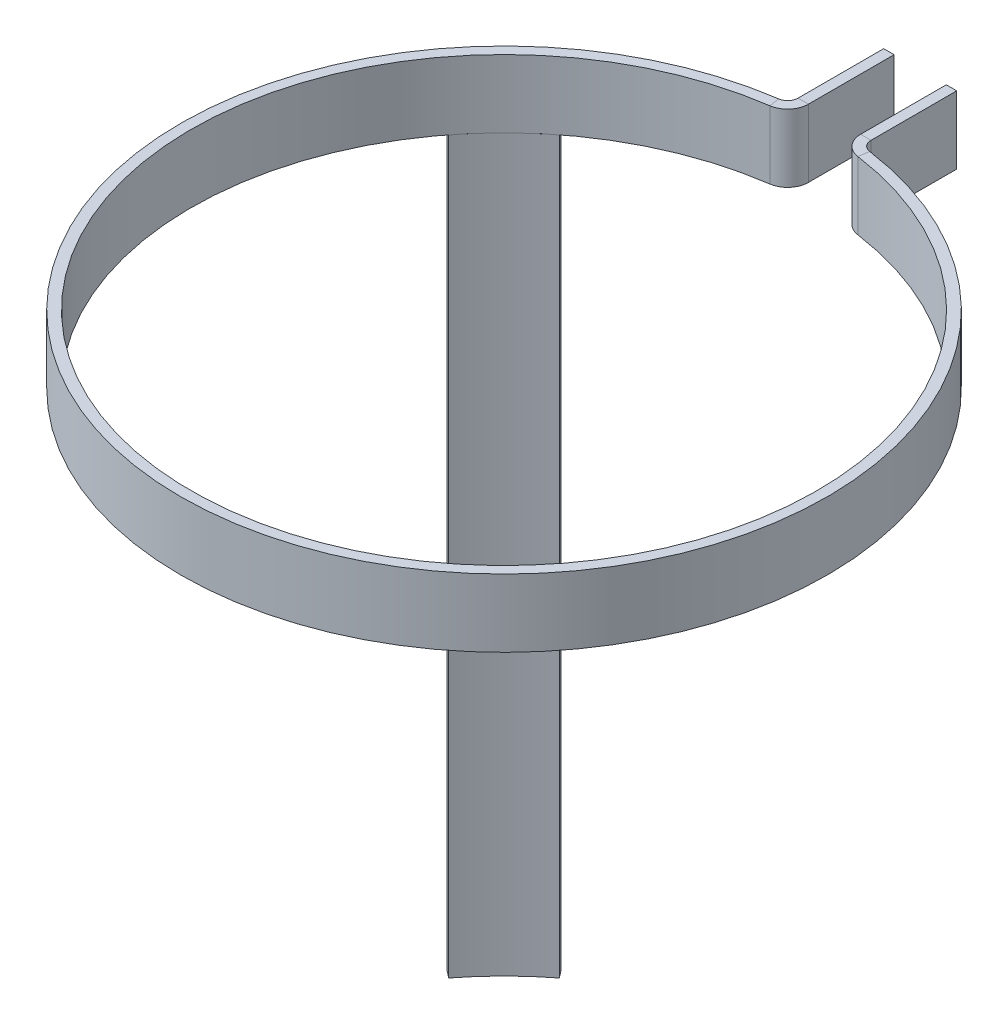
ISO-10303-21;
HEADER;
FILE_DESCRIPTION(('STEP AP214'),'2;1');
FILE_NAME('part.step','',(''),(''),'','','');
FILE_SCHEMA(('AUTOMOTIVE_DESIGN { 1 0 10303 214 1 1 1 1 }'));
ENDSEC;
DATA;
#1=APPLICATION_CONTEXT('core data for automotive mechanical design processes');
#2=APPLICATION_PROTOCOL_DEFINITION('international standard','automotive_design',2000,#1);
#3=PRODUCT_CONTEXT('',#1,'mechanical');
#4=PRODUCT('Part','Part','',(#3));
#5=PRODUCT_RELATED_PRODUCT_CATEGORY('part','',(#4));
#6=PRODUCT_DEFINITION_FORMATION('','',#4);
#7=PRODUCT_DEFINITION_CONTEXT('part definition',#1,'design');
#8=PRODUCT_DEFINITION('design','',#6,#7);
#9=PRODUCT_DEFINITION_SHAPE('','',#8);
#10=(LENGTH_UNIT() NAMED_UNIT(*) SI_UNIT(.MILLI.,.METRE.));
#11=(NAMED_UNIT(*) PLANE_ANGLE_UNIT() SI_UNIT($,.RADIAN.));
#12=(NAMED_UNIT(*) SI_UNIT($,.STERADIAN.) SOLID_ANGLE_UNIT());
#13=UNCERTAINTY_MEASURE_WITH_UNIT(LENGTH_MEASURE(1.E-05),#10,'distance_accuracy_value','');
#14=(GEOMETRIC_REPRESENTATION_CONTEXT(3) GLOBAL_UNCERTAINTY_ASSIGNED_CONTEXT((#13)) GLOBAL_UNIT_ASSIGNED_CONTEXT((#10,
#11,#12)) REPRESENTATION_CONTEXT('',''));
#15=CARTESIAN_POINT('',(0.,0.,0.));
#16=DIRECTION('',(0.,0.,1.));
#17=DIRECTION('',(1.,0.,0.));
#18=AXIS2_PLACEMENT_3D('',#15,#16,#17);
#19=CARTESIAN_POINT('',(3.08780778723872E-13,-88.9,3.7470027081099E-13));
#20=DIRECTION('',(0.,1.,0.));
#21=DIRECTION('',(0.,0.,1.));
#22=AXIS2_PLACEMENT_3D('',#19,#20,#21);
#23=CYLINDRICAL_SURFACE('',#22,38.1000000000005);
#24=CARTESIAN_POINT('',(3.08780778723872E-13,0.,3.7470027081099E-13));
#25=DIRECTION('',(0.,1.,0.));
#26=DIRECTION('',(0.,0.,1.));
#27=AXIS2_PLACEMENT_3D('',#24,#25,#26);
#28=CIRCLE('',#27,38.1000000000005);
#29=CARTESIAN_POINT('',(-23.3618689113653,0.,-30.0970610021673));
#30=VERTEX_POINT('',#29);
#31=CARTESIAN_POINT('',(-30.0970610021672,0.,-23.3618689113655));
#32=VERTEX_POINT('',#31);
#33=EDGE_CURVE('E112',#30,#32,#28,.T.);
#34=ORIENTED_EDGE('',*,*,#33,.T.);
#35=DIRECTION('',(0.,1.,0.));
#36=VECTOR('',#35,1.);
#37=CARTESIAN_POINT('',(-30.0970610021672,-88.9,-23.3618689113655));
#38=LINE('',#37,#36);
#39=CARTESIAN_POINT('',(-30.0970610021672,-88.9,-23.3618689113655));
#40=VERTEX_POINT('',#39);
#41=EDGE_CURVE('E12',#40,#32,#38,.T.);
#42=ORIENTED_EDGE('',*,*,#41,.F.);
#43=CARTESIAN_POINT('',(3.08780778723872E-13,-88.9,3.7470027081099E-13));
#44=DIRECTION('',(0.,1.,0.));
#45=DIRECTION('',(0.,0.,1.));
#46=AXIS2_PLACEMENT_3D('',#43,#44,#45);
#47=CIRCLE('',#46,38.1000000000005);
#48=CARTESIAN_POINT('',(-23.3618689113653,-88.9,-30.0970610021673));
#49=VERTEX_POINT('',#48);
#50=EDGE_CURVE('E100',#49,#40,#47,.T.);
#51=ORIENTED_EDGE('',*,*,#50,.F.);
#52=DIRECTION('',(0.,1.,0.));
#53=VECTOR('',#52,1.);
#54=CARTESIAN_POINT('',(-23.3618689113653,-88.9,-30.0970610021673));
#55=LINE('',#54,#53);
#56=EDGE_CURVE('E108',#49,#30,#55,.T.);
#57=ORIENTED_EDGE('',*,*,#56,.T.);
#58=EDGE_LOOP('',(#34,#42,#51,#57));
#59=FACE_BOUND('',#58,.T.);
#60=ADVANCED_FACE('F49',(#59),#23,.F.);
#61=CARTESIAN_POINT('',(-31.1002963689061,-88.9,-24.1405978750777));
#62=DIRECTION('',(0.613172412371804,0.,-0.789949107668426));
#63=DIRECTION('',(-0.789949107668426,0.,-0.613172412371804));
#64=AXIS2_PLACEMENT_3D('',#61,#62,#63);
#65=PLANE('',#64);
#66=DIRECTION('',(-0.789949107668426,0.,-0.613172412371804));
#67=VECTOR('',#66,1.);
#68=CARTESIAN_POINT('',(-31.1002963689061,0.,-24.1405978750777));
#69=LINE('',#68,#67);
#70=CARTESIAN_POINT('',(-31.1002963689062,0.,-24.1405978750776));
#71=VERTEX_POINT('',#70);
#72=EDGE_CURVE('E104',#32,#71,#69,.T.);
#73=ORIENTED_EDGE('',*,*,#72,.T.);
#74=DIRECTION('',(0.,1.,0.));
#75=VECTOR('',#74,1.);
#76=CARTESIAN_POINT('',(-31.1002963689062,-88.9,-24.1405978750776));
#77=LINE('',#76,#75);
#78=CARTESIAN_POINT('',(-31.1002963689062,-88.9,-24.1405978750776));
#79=VERTEX_POINT('',#78);
#80=EDGE_CURVE('E57',#79,#71,#77,.T.);
#81=ORIENTED_EDGE('',*,*,#80,.F.);
#82=DIRECTION('',(-0.789949107668426,0.,-0.613172412371804));
#83=VECTOR('',#82,1.);
#84=CARTESIAN_POINT('',(-31.1002963689061,-88.9,-24.1405978750777));
#85=LINE('',#84,#83);
#86=EDGE_CURVE('E95',#40,#79,#85,.T.);
#87=ORIENTED_EDGE('',*,*,#86,.F.);
#88=ORIENTED_EDGE('',*,*,#41,.T.);
#89=EDGE_LOOP('',(#73,#81,#87,#88));
#90=FACE_BOUND('',#89,.T.);
#91=ADVANCED_FACE('F103',(#90),#65,.F.);
#92=CARTESIAN_POINT('',(0.,-88.9,0.));
#93=DIRECTION('',(0.,1.,0.));
#94=DIRECTION('',(0.,0.,1.));
#95=AXIS2_PLACEMENT_3D('',#92,#93,#94);
#96=CYLINDRICAL_SURFACE('',#95,39.37);
#97=CARTESIAN_POINT('',(0.,0.,0.));
#98=DIRECTION('',(0.,-1.,0.));
#99=DIRECTION('',(0.,0.,-1.));
#100=AXIS2_PLACEMENT_3D('',#97,#98,#99);
#101=CIRCLE('',#100,39.37);
#102=CARTESIAN_POINT('',(-24.1405978750775,0.,-31.1002963689062));
#103=VERTEX_POINT('',#102);
#104=EDGE_CURVE('E82',#71,#103,#101,.T.);
#105=ORIENTED_EDGE('',*,*,#104,.T.);
#106=DIRECTION('',(0.,1.,0.));
#107=VECTOR('',#106,1.);
#108=CARTESIAN_POINT('',(-24.1405978750775,-88.9,-31.1002963689062));
#109=LINE('',#108,#107);
#110=CARTESIAN_POINT('',(-24.1405978750775,-88.9,-31.1002963689062));
#111=VERTEX_POINT('',#110);
#112=EDGE_CURVE('E105',#111,#103,#109,.T.);
#113=ORIENTED_EDGE('',*,*,#112,.F.);
#114=CARTESIAN_POINT('',(0.,-88.9,0.));
#115=DIRECTION('',(0.,-1.,0.));
#116=DIRECTION('',(0.,0.,-1.));
#117=AXIS2_PLACEMENT_3D('',#114,#115,#116);
#118=CIRCLE('',#117,39.37);
#119=EDGE_CURVE('E98',#79,#111,#118,.T.);
#120=ORIENTED_EDGE('',*,*,#119,.F.);
#121=ORIENTED_EDGE('',*,*,#80,.T.);
#122=EDGE_LOOP('',(#105,#113,#120,#121));
#123=FACE_BOUND('',#122,.T.);
#124=ADVANCED_FACE('F106',(#123),#96,.T.);
#125=CARTESIAN_POINT('',(-24.1405978750775,-88.9,-31.1002963689062));
#126=DIRECTION('',(-0.789949107668428,0.,0.613172412371801));
#127=DIRECTION('',(0.613172412371801,0.,0.789949107668428));
#128=AXIS2_PLACEMENT_3D('',#125,#126,#127);
#129=PLANE('',#128);
#130=DIRECTION('',(0.613172412371801,0.,0.789949107668428));
#131=VECTOR('',#130,1.);
#132=CARTESIAN_POINT('',(-24.1405978750775,0.,-31.1002963689062));
#133=LINE('',#132,#131);
#134=EDGE_CURVE('E88',#103,#30,#133,.T.);
#135=ORIENTED_EDGE('',*,*,#134,.T.);
#136=ORIENTED_EDGE('',*,*,#56,.F.);
#137=DIRECTION('',(0.613172412371801,0.,0.789949107668428));
#138=VECTOR('',#137,1.);
#139=CARTESIAN_POINT('',(-24.1405978750775,-88.9,-31.1002963689062));
#140=LINE('',#139,#138);
#141=EDGE_CURVE('E65',#111,#49,#140,.T.);
#142=ORIENTED_EDGE('',*,*,#141,.F.);
#143=ORIENTED_EDGE('',*,*,#112,.T.);
#144=EDGE_LOOP('',(#135,#136,#142,#143));
#145=FACE_BOUND('',#144,.T.);
#146=ADVANCED_FACE('F119',(#145),#129,.F.);
#147=CARTESIAN_POINT('',(3.08780778723872E-13,-88.9,3.7470027081099E-13));
#148=DIRECTION('',(0.,1.,0.));
#149=DIRECTION('',(0.,0.,1.));
#150=AXIS2_PLACEMENT_3D('',#147,#148,#149);
#151=PLANE('',#150);
#152=ORIENTED_EDGE('',*,*,#50,.T.);
#153=ORIENTED_EDGE('',*,*,#86,.T.);
#154=ORIENTED_EDGE('',*,*,#119,.T.);
#155=ORIENTED_EDGE('',*,*,#141,.T.);
#156=EDGE_LOOP('',(#152,#153,#154,#155));
#157=FACE_BOUND('',#156,.T.);
#158=ADVANCED_FACE('F96',(#157),#151,.F.);
#159=CARTESIAN_POINT('',(3.08780778723872E-13,0.,3.7470027081099E-13));
#160=DIRECTION('',(0.,1.,0.));
#161=DIRECTION('',(0.,0.,1.));
#162=AXIS2_PLACEMENT_3D('',#159,#160,#161);
#163=PLANE('',#162);
#164=ORIENTED_EDGE('',*,*,#33,.F.);
#165=ORIENTED_EDGE('',*,*,#134,.F.);
#166=ORIENTED_EDGE('',*,*,#104,.F.);
#167=ORIENTED_EDGE('',*,*,#72,.F.);
#168=EDGE_LOOP('',(#164,#165,#166,#167));
#169=FACE_BOUND('',#168,.T.);
#170=ADVANCED_FACE('F122',(#169),#163,.T.);
#171=CLOSED_SHELL('',(#60,#91,#124,#146,#158,#170));
#172=MANIFOLD_SOLID_BREP('B2',#171);
#173=CARTESIAN_POINT('',(3.175,8.255,-40.2361575575999));
#174=DIRECTION('',(0.,1.,0.));
#175=DIRECTION('',(0.,0.,1.));
#176=AXIS2_PLACEMENT_3D('',#173,#174,#175);
#177=PLANE('',#176);
#178=DIRECTION('',(1.,0.,0.));
#179=VECTOR('',#178,1.);
#180=CARTESIAN_POINT('',(3.175,8.255,-40.2361575575999));
#181=LINE('',#180,#179);
#182=CARTESIAN_POINT('',(3.175,8.255,-40.2361575575999));
#183=VERTEX_POINT('',#182);
#184=CARTESIAN_POINT('',(4.445,8.255,-40.2361575575999));
#185=VERTEX_POINT('',#184);
#186=EDGE_CURVE('E47',#183,#185,#181,.T.);
#187=ORIENTED_EDGE('',*,*,#186,.F.);
#188=CARTESIAN_POINT('',(5.715,8.255,-40.2361575575999));
#189=DIRECTION('',(0.,-1.,0.));
#190=DIRECTION('',(0.,0.,-1.));
#191=AXIS2_PLACEMENT_3D('',#188,#189,#190);
#192=CIRCLE('',#191,2.54);
#193=CARTESIAN_POINT('',(5.3578125,8.255,-37.7213977102499));
#194=VERTEX_POINT('',#193);
#195=EDGE_CURVE('E295',#183,#194,#192,.F.);
#196=ORIENTED_EDGE('',*,*,#195,.T.);
#197=DIRECTION('',(-0.140625000000003,0.,0.990062932027555));
#198=VECTOR('',#197,1.);
#199=CARTESIAN_POINT('',(5.53640625,8.255,-38.9787776339249));
#200=LINE('',#199,#198);
#201=CARTESIAN_POINT('',(5.53640625,8.255,-38.9787776339249));
#202=VERTEX_POINT('',#201);
#203=EDGE_CURVE('E193',#202,#194,#200,.T.);
#204=ORIENTED_EDGE('',*,*,#203,.F.);
#205=CARTESIAN_POINT('',(5.715,8.255,-40.2361575575999));
#206=DIRECTION('',(0.,1.,0.));
#207=DIRECTION('',(1.,0.,0.));
#208=AXIS2_PLACEMENT_3D('',#205,#206,#207);
#209=CIRCLE('',#208,1.27);
#210=EDGE_CURVE('E389',#185,#202,#209,.T.);
#211=ORIENTED_EDGE('',*,*,#210,.F.);
#212=EDGE_LOOP('',(#187,#196,#204,#211));
#213=FACE_BOUND('',#212,.T.);
#214=ADVANCED_FACE('F185',(#213),#177,.T.);
#215=CARTESIAN_POINT('',(5.53640625,8.255,-38.9787776339249));
#216=DIRECTION('',(0.,1.,0.));
#217=DIRECTION('',(0.,0.,1.));
#218=AXIS2_PLACEMENT_3D('',#215,#216,#217);
#219=PLANE('',#218);
#220=DIRECTION('',(0.,0.,1.));
#221=VECTOR('',#220,1.);
#222=CARTESIAN_POINT('',(3.175,8.255,-37.9674778593469));
#223=LINE('',#222,#221);
#224=CARTESIAN_POINT('',(3.175,8.255,-50.6674778593469));
#225=VERTEX_POINT('',#224);
#226=EDGE_CURVE('E300',#225,#183,#223,.T.);
#227=ORIENTED_EDGE('',*,*,#226,.T.);
#228=ORIENTED_EDGE('',*,*,#186,.T.);
#229=DIRECTION('',(0.,0.,-1.));
#230=VECTOR('',#229,1.);
#231=CARTESIAN_POINT('',(4.445,8.255,-37.9674778593469));
#232=LINE('',#231,#230);
#233=CARTESIAN_POINT('',(4.445,8.255,-50.6674778593469));
#234=VERTEX_POINT('',#233);
#235=EDGE_CURVE('E402',#234,#185,#232,.F.);
#236=ORIENTED_EDGE('',*,*,#235,.F.);
#237=DIRECTION('',(1.,0.,0.));
#238=VECTOR('',#237,1.);
#239=CARTESIAN_POINT('',(3.175,8.255,-50.6674778593469));
#240=LINE('',#239,#238);
#241=EDGE_CURVE('E404',#225,#234,#240,.T.);
#242=ORIENTED_EDGE('',*,*,#241,.F.);
#243=EDGE_LOOP('',(#227,#228,#236,#242));
#244=FACE_BOUND('',#243,.T.);
#245=ADVANCED_FACE('F415',(#244),#219,.T.);
#246=CARTESIAN_POINT('',(5.3578125,0.,-37.7213977102499));
#247=DIRECTION('',(0.,-1.,0.));
#248=DIRECTION('',(0.,0.,-1.));
#249=AXIS2_PLACEMENT_3D('',#246,#247,#248);
#250=PLANE('',#249);
#251=DIRECTION('',(0.140625000000003,0.,-0.990062932027555));
#252=VECTOR('',#251,1.);
#253=CARTESIAN_POINT('',(5.3578125,0.,-37.7213977102499));
#254=LINE('',#253,#252);
#255=CARTESIAN_POINT('',(5.3578125,0.,-37.7213977102499));
#256=VERTEX_POINT('',#255);
#257=CARTESIAN_POINT('',(5.53640625,0.,-38.9787776339249));
#258=VERTEX_POINT('',#257);
#259=EDGE_CURVE('E293',#256,#258,#254,.T.);
#260=ORIENTED_EDGE('',*,*,#259,.F.);
#261=CARTESIAN_POINT('',(5.715,0.,-40.2361575575999));
#262=DIRECTION('',(0.,-1.,0.));
#263=DIRECTION('',(0.,0.,-1.));
#264=AXIS2_PLACEMENT_3D('',#261,#262,#263);
#265=CIRCLE('',#264,2.54);
#266=CARTESIAN_POINT('',(3.175,0.,-40.2361575575999));
#267=VERTEX_POINT('',#266);
#268=EDGE_CURVE('E307',#267,#256,#265,.F.);
#269=ORIENTED_EDGE('',*,*,#268,.F.);
#270=DIRECTION('',(-1.,0.,0.));
#271=VECTOR('',#270,1.);
#272=CARTESIAN_POINT('',(4.445,0.,-40.2361575575999));
#273=LINE('',#272,#271);
#274=CARTESIAN_POINT('',(4.445,0.,-40.2361575575999));
#275=VERTEX_POINT('',#274);
#276=EDGE_CURVE('E380',#275,#267,#273,.T.);
#277=ORIENTED_EDGE('',*,*,#276,.F.);
#278=CARTESIAN_POINT('',(5.715,0.,-40.2361575575999));
#279=DIRECTION('',(0.,1.,0.));
#280=DIRECTION('',(1.,0.,0.));
#281=AXIS2_PLACEMENT_3D('',#278,#279,#280);
#282=CIRCLE('',#281,1.27);
#283=EDGE_CURVE('E334',#275,#258,#282,.T.);
#284=ORIENTED_EDGE('',*,*,#283,.T.);
#285=EDGE_LOOP('',(#260,#269,#277,#284));
#286=FACE_BOUND('',#285,.T.);
#287=ADVANCED_FACE('F394',(#286),#250,.T.);
#288=CARTESIAN_POINT('',(4.445,0.,-40.2361575575999));
#289=DIRECTION('',(0.,-1.,0.));
#290=DIRECTION('',(0.,0.,-1.));
#291=AXIS2_PLACEMENT_3D('',#288,#289,#290);
#292=PLANE('',#291);
#293=CARTESIAN_POINT('',(0.,0.,0.));
#294=DIRECTION('',(0.,-1.,0.));
#295=DIRECTION('',(0.,0.,-1.));
#296=AXIS2_PLACEMENT_3D('',#293,#294,#295);
#297=CIRCLE('',#296,38.1);
#298=CARTESIAN_POINT('',(-5.3578125,0.,-37.7213977102499));
#299=VERTEX_POINT('',#298);
#300=EDGE_CURVE('E347',#256,#299,#297,.T.);
#301=ORIENTED_EDGE('',*,*,#300,.F.);
#302=ORIENTED_EDGE('',*,*,#259,.T.);
#303=CARTESIAN_POINT('',(0.,0.,0.));
#304=DIRECTION('',(0.,1.,0.));
#305=DIRECTION('',(1.,0.,0.));
#306=AXIS2_PLACEMENT_3D('',#303,#304,#305);
#307=CIRCLE('',#306,39.37);
#308=CARTESIAN_POINT('',(-5.53640625,0.,-38.9787776339249));
#309=VERTEX_POINT('',#308);
#310=EDGE_CURVE('E332',#258,#309,#307,.F.);
#311=ORIENTED_EDGE('',*,*,#310,.T.);
#312=DIRECTION('',(0.140624999999999,0.,0.990062932027556));
#313=VECTOR('',#312,1.);
#314=CARTESIAN_POINT('',(-5.53640625,0.,-38.9787776339249));
#315=LINE('',#314,#313);
#316=EDGE_CURVE('E242',#309,#299,#315,.T.);
#317=ORIENTED_EDGE('',*,*,#316,.T.);
#318=EDGE_LOOP('',(#301,#302,#311,#317));
#319=FACE_BOUND('',#318,.T.);
#320=ADVANCED_FACE('F382',(#319),#292,.T.);
#321=CARTESIAN_POINT('',(-5.3578125,8.255,-37.7213977102499));
#322=DIRECTION('',(0.,1.,0.));
#323=DIRECTION('',(0.,0.,1.));
#324=AXIS2_PLACEMENT_3D('',#321,#322,#323);
#325=PLANE('',#324);
#326=DIRECTION('',(-0.140624999999999,0.,-0.990062932027556));
#327=VECTOR('',#326,1.);
#328=CARTESIAN_POINT('',(-5.3578125,8.255,-37.7213977102499));
#329=LINE('',#328,#327);
#330=CARTESIAN_POINT('',(-5.3578125,8.255,-37.7213977102499));
#331=VERTEX_POINT('',#330);
#332=CARTESIAN_POINT('',(-5.53640625,8.255,-38.9787776339249));
#333=VERTEX_POINT('',#332);
#334=EDGE_CURVE('E378',#331,#333,#329,.T.);
#335=ORIENTED_EDGE('',*,*,#334,.F.);
#336=CARTESIAN_POINT('',(-5.715,8.255,-40.2361575575999));
#337=DIRECTION('',(0.,-1.,0.));
#338=DIRECTION('',(0.,0.,-1.));
#339=AXIS2_PLACEMENT_3D('',#336,#337,#338);
#340=CIRCLE('',#339,2.54);
#341=CARTESIAN_POINT('',(-3.175,8.255,-40.2361575575999));
#342=VERTEX_POINT('',#341);
#343=EDGE_CURVE('E315',#331,#342,#340,.F.);
#344=ORIENTED_EDGE('',*,*,#343,.T.);
#345=DIRECTION('',(1.,0.,0.));
#346=VECTOR('',#345,1.);
#347=CARTESIAN_POINT('',(-4.445,8.255,-40.2361575575999));
#348=LINE('',#347,#346);
#349=CARTESIAN_POINT('',(-4.445,8.255,-40.2361575575999));
#350=VERTEX_POINT('',#349);
#351=EDGE_CURVE('E201',#350,#342,#348,.T.);
#352=ORIENTED_EDGE('',*,*,#351,.F.);
#353=CARTESIAN_POINT('',(-5.715,8.255,-40.2361575575999));
#354=DIRECTION('',(0.,1.,0.));
#355=DIRECTION('',(1.,0.,0.));
#356=AXIS2_PLACEMENT_3D('',#353,#354,#355);
#357=CIRCLE('',#356,1.27);
#358=EDGE_CURVE('E406',#333,#350,#357,.T.);
#359=ORIENTED_EDGE('',*,*,#358,.F.);
#360=EDGE_LOOP('',(#335,#344,#352,#359));
#361=FACE_BOUND('',#360,.T.);
#362=ADVANCED_FACE('F441',(#361),#325,.T.);
#363=CARTESIAN_POINT('',(-4.445,8.255,-40.2361575575999));
#364=DIRECTION('',(0.,1.,0.));
#365=DIRECTION('',(0.,0.,1.));
#366=AXIS2_PLACEMENT_3D('',#363,#364,#365);
#367=PLANE('',#366);
#368=CARTESIAN_POINT('',(0.,8.255,0.));
#369=DIRECTION('',(0.,-1.,0.));
#370=DIRECTION('',(0.,0.,-1.));
#371=AXIS2_PLACEMENT_3D('',#368,#369,#370);
#372=CIRCLE('',#371,38.1);
#373=EDGE_CURVE('E285',#194,#331,#372,.T.);
#374=ORIENTED_EDGE('',*,*,#373,.T.);
#375=ORIENTED_EDGE('',*,*,#334,.T.);
#376=CARTESIAN_POINT('',(0.,8.255,0.));
#377=DIRECTION('',(0.,1.,0.));
#378=DIRECTION('',(1.,0.,0.));
#379=AXIS2_PLACEMENT_3D('',#376,#377,#378);
#380=CIRCLE('',#379,39.37);
#381=EDGE_CURVE('E288',#202,#333,#380,.F.);
#382=ORIENTED_EDGE('',*,*,#381,.F.);
#383=ORIENTED_EDGE('',*,*,#203,.T.);
#384=EDGE_LOOP('',(#374,#375,#382,#383));
#385=FACE_BOUND('',#384,.T.);
#386=ADVANCED_FACE('F283',(#385),#367,.T.);
#387=CARTESIAN_POINT('',(-3.175,0.,-40.2361575575999));
#388=DIRECTION('',(0.,-1.,0.));
#389=DIRECTION('',(0.,0.,-1.));
#390=AXIS2_PLACEMENT_3D('',#387,#388,#389);
#391=PLANE('',#390);
#392=DIRECTION('',(-1.,0.,0.));
#393=VECTOR('',#392,1.);
#394=CARTESIAN_POINT('',(-3.175,0.,-40.2361575575999));
#395=LINE('',#394,#393);
#396=CARTESIAN_POINT('',(-3.175,0.,-40.2361575575999));
#397=VERTEX_POINT('',#396);
#398=CARTESIAN_POINT('',(-4.445,0.,-40.2361575575999));
#399=VERTEX_POINT('',#398);
#400=EDGE_CURVE('E249',#397,#399,#395,.T.);
#401=ORIENTED_EDGE('',*,*,#400,.F.);
#402=CARTESIAN_POINT('',(-5.715,0.,-40.2361575575999));
#403=DIRECTION('',(0.,-1.,0.));
#404=DIRECTION('',(0.,0.,-1.));
#405=AXIS2_PLACEMENT_3D('',#402,#403,#404);
#406=CIRCLE('',#405,2.54);
#407=EDGE_CURVE('E349',#299,#397,#406,.F.);
#408=ORIENTED_EDGE('',*,*,#407,.F.);
#409=ORIENTED_EDGE('',*,*,#316,.F.);
#410=CARTESIAN_POINT('',(-5.715,0.,-40.2361575575999));
#411=DIRECTION('',(0.,1.,0.));
#412=DIRECTION('',(1.,0.,0.));
#413=AXIS2_PLACEMENT_3D('',#410,#411,#412);
#414=CIRCLE('',#413,1.27);
#415=EDGE_CURVE('E330',#309,#399,#414,.T.);
#416=ORIENTED_EDGE('',*,*,#415,.T.);
#417=EDGE_LOOP('',(#401,#408,#409,#416));
#418=FACE_BOUND('',#417,.T.);
#419=ADVANCED_FACE('F447',(#418),#391,.T.);
#420=CARTESIAN_POINT('',(-5.53640625,0.,-38.9787776339249));
#421=DIRECTION('',(0.,-1.,0.));
#422=DIRECTION('',(0.,0.,-1.));
#423=AXIS2_PLACEMENT_3D('',#420,#421,#422);
#424=PLANE('',#423);
#425=DIRECTION('',(0.,0.,-1.));
#426=VECTOR('',#425,1.);
#427=CARTESIAN_POINT('',(-3.175,0.,-37.9674778593469));
#428=LINE('',#427,#426);
#429=CARTESIAN_POINT('',(-3.175,0.,-50.6674778593469));
#430=VERTEX_POINT('',#429);
#431=EDGE_CURVE('E321',#397,#430,#428,.T.);
#432=ORIENTED_EDGE('',*,*,#431,.F.);
#433=ORIENTED_EDGE('',*,*,#400,.T.);
#434=DIRECTION('',(0.,0.,-1.));
#435=VECTOR('',#434,1.);
#436=CARTESIAN_POINT('',(-4.445,0.,-37.9674778593469));
#437=LINE('',#436,#435);
#438=CARTESIAN_POINT('',(-4.445,0.,-50.6674778593469));
#439=VERTEX_POINT('',#438);
#440=EDGE_CURVE('E327',#399,#439,#437,.T.);
#441=ORIENTED_EDGE('',*,*,#440,.T.);
#442=DIRECTION('',(1.,0.,0.));
#443=VECTOR('',#442,1.);
#444=CARTESIAN_POINT('',(-4.445,0.,-50.6674778593469));
#445=LINE('',#444,#443);
#446=EDGE_CURVE('E324',#439,#430,#445,.T.);
#447=ORIENTED_EDGE('',*,*,#446,.T.);
#448=EDGE_LOOP('',(#432,#433,#441,#447));
#449=FACE_BOUND('',#448,.T.);
#450=ADVANCED_FACE('F450',(#449),#424,.T.);
#451=CARTESIAN_POINT('',(-3.175,8.255,-37.9674778593469));
#452=DIRECTION('',(-1.,0.,0.));
#453=DIRECTION('',(0.,0.,1.));
#454=AXIS2_PLACEMENT_3D('',#451,#452,#453);
#455=PLANE('',#454);
#456=ORIENTED_EDGE('',*,*,#431,.T.);
#457=DIRECTION('',(0.,-1.,0.));
#458=VECTOR('',#457,1.);
#459=CARTESIAN_POINT('',(-3.175,8.255,-50.6674778593469));
#460=LINE('',#459,#458);
#461=CARTESIAN_POINT('',(-3.175,8.255,-50.6674778593469));
#462=VERTEX_POINT('',#461);
#463=EDGE_CURVE('E373',#462,#430,#460,.T.);
#464=ORIENTED_EDGE('',*,*,#463,.F.);
#465=DIRECTION('',(0.,0.,-1.));
#466=VECTOR('',#465,1.);
#467=CARTESIAN_POINT('',(-3.175,8.255,-37.9674778593469));
#468=LINE('',#467,#466);
#469=EDGE_CURVE('E255',#342,#462,#468,.T.);
#470=ORIENTED_EDGE('',*,*,#469,.F.);
#471=DIRECTION('',(0.,-1.,0.));
#472=VECTOR('',#471,1.);
#473=CARTESIAN_POINT('',(-3.175,8.255,-40.2361575575999));
#474=LINE('',#473,#472);
#475=EDGE_CURVE('E317',#342,#397,#474,.T.);
#476=ORIENTED_EDGE('',*,*,#475,.T.);
#477=EDGE_LOOP('',(#456,#464,#470,#476));
#478=FACE_BOUND('',#477,.T.);
#479=ADVANCED_FACE('F453',(#478),#455,.F.);
#480=CARTESIAN_POINT('',(-4.445,8.255,-50.6674778593469));
#481=DIRECTION('',(0.,0.,-1.));
#482=DIRECTION('',(-1.,0.,0.));
#483=AXIS2_PLACEMENT_3D('',#480,#481,#482);
#484=PLANE('',#483);
#485=ORIENTED_EDGE('',*,*,#446,.F.);
#486=DIRECTION('',(0.,-1.,0.));
#487=VECTOR('',#486,1.);
#488=CARTESIAN_POINT('',(-4.445,8.255,-50.6674778593469));
#489=LINE('',#488,#487);
#490=CARTESIAN_POINT('',(-4.445,8.255,-50.6674778593469));
#491=VERTEX_POINT('',#490);
#492=EDGE_CURVE('E371',#491,#439,#489,.T.);
#493=ORIENTED_EDGE('',*,*,#492,.F.);
#494=DIRECTION('',(1.,0.,0.));
#495=VECTOR('',#494,1.);
#496=CARTESIAN_POINT('',(-4.445,8.255,-50.6674778593469));
#497=LINE('',#496,#495);
#498=EDGE_CURVE('E661',#491,#462,#497,.T.);
#499=ORIENTED_EDGE('',*,*,#498,.T.);
#500=ORIENTED_EDGE('',*,*,#463,.T.);
#501=EDGE_LOOP('',(#485,#493,#499,#500));
#502=FACE_BOUND('',#501,.T.);
#503=ADVANCED_FACE('F457',(#502),#484,.T.);
#504=CARTESIAN_POINT('',(-4.445,8.255,-37.9674778593469));
#505=DIRECTION('',(-1.,0.,0.));
#506=DIRECTION('',(0.,0.,1.));
#507=AXIS2_PLACEMENT_3D('',#504,#505,#506);
#508=PLANE('',#507);
#509=ORIENTED_EDGE('',*,*,#440,.F.);
#510=DIRECTION('',(0.,-1.,0.));
#511=VECTOR('',#510,1.);
#512=CARTESIAN_POINT('',(-4.445,8.255,-40.2361575575999));
#513=LINE('',#512,#511);
#514=EDGE_CURVE('E368',#350,#399,#513,.T.);
#515=ORIENTED_EDGE('',*,*,#514,.F.);
#516=DIRECTION('',(0.,0.,-1.));
#517=VECTOR('',#516,1.);
#518=CARTESIAN_POINT('',(-4.445,8.255,-37.9674778593469));
#519=LINE('',#518,#517);
#520=EDGE_CURVE('E663',#350,#491,#519,.T.);
#521=ORIENTED_EDGE('',*,*,#520,.T.);
#522=ORIENTED_EDGE('',*,*,#492,.T.);
#523=EDGE_LOOP('',(#509,#515,#521,#522));
#524=FACE_BOUND('',#523,.T.);
#525=ADVANCED_FACE('F461',(#524),#508,.T.);
#526=CARTESIAN_POINT('',(-5.715,8.255,-40.2361575575999));
#527=DIRECTION('',(0.,-1.,0.));
#528=DIRECTION('',(0.,0.,-1.));
#529=AXIS2_PLACEMENT_3D('',#526,#527,#528);
#530=CYLINDRICAL_SURFACE('',#529,1.27);
#531=ORIENTED_EDGE('',*,*,#415,.F.);
#532=DIRECTION('',(0.,-1.,0.));
#533=VECTOR('',#532,1.);
#534=CARTESIAN_POINT('',(-5.53640625,8.255,-38.9787776339249));
#535=LINE('',#534,#533);
#536=EDGE_CURVE('E365',#333,#309,#535,.T.);
#537=ORIENTED_EDGE('',*,*,#536,.F.);
#538=ORIENTED_EDGE('',*,*,#358,.T.);
#539=ORIENTED_EDGE('',*,*,#514,.T.);
#540=EDGE_LOOP('',(#531,#537,#538,#539));
#541=FACE_BOUND('',#540,.T.);
#542=ADVANCED_FACE('F465',(#541),#530,.F.);
#543=CARTESIAN_POINT('',(0.,8.255,0.));
#544=DIRECTION('',(0.,-1.,0.));
#545=DIRECTION('',(0.,0.,-1.));
#546=AXIS2_PLACEMENT_3D('',#543,#544,#545);
#547=CYLINDRICAL_SURFACE('',#546,39.37);
#548=ORIENTED_EDGE('',*,*,#310,.F.);
#549=DIRECTION('',(0.,-1.,0.));
#550=VECTOR('',#549,1.);
#551=CARTESIAN_POINT('',(5.53640625,8.255,-38.9787776339249));
#552=LINE('',#551,#550);
#553=EDGE_CURVE('E362',#202,#258,#552,.T.);
#554=ORIENTED_EDGE('',*,*,#553,.F.);
#555=ORIENTED_EDGE('',*,*,#381,.T.);
#556=ORIENTED_EDGE('',*,*,#536,.T.);
#557=EDGE_LOOP('',(#548,#554,#555,#556));
#558=FACE_BOUND('',#557,.T.);
#559=ADVANCED_FACE('F391',(#558),#547,.T.);
#560=CARTESIAN_POINT('',(5.715,8.255,-40.2361575575999));
#561=DIRECTION('',(0.,-1.,0.));
#562=DIRECTION('',(0.,0.,-1.));
#563=AXIS2_PLACEMENT_3D('',#560,#561,#562);
#564=CYLINDRICAL_SURFACE('',#563,1.27);
#565=ORIENTED_EDGE('',*,*,#283,.F.);
#566=DIRECTION('',(0.,-1.,0.));
#567=VECTOR('',#566,1.);
#568=CARTESIAN_POINT('',(4.445,8.255,-40.2361575575999));
#569=LINE('',#568,#567);
#570=EDGE_CURVE('E359',#185,#275,#569,.T.);
#571=ORIENTED_EDGE('',*,*,#570,.F.);
#572=ORIENTED_EDGE('',*,*,#210,.T.);
#573=ORIENTED_EDGE('',*,*,#553,.T.);
#574=EDGE_LOOP('',(#565,#571,#572,#573));
#575=FACE_BOUND('',#574,.T.);
#576=ADVANCED_FACE('F387',(#575),#564,.F.);
#577=CARTESIAN_POINT('',(4.445,8.255,-37.9674778593469));
#578=DIRECTION('',(1.,0.,0.));
#579=DIRECTION('',(0.,0.,-1.));
#580=AXIS2_PLACEMENT_3D('',#577,#578,#579);
#581=PLANE('',#580);
#582=DIRECTION('',(0.,0.,-1.));
#583=VECTOR('',#582,1.);
#584=CARTESIAN_POINT('',(4.445,0.,-37.9674778593469));
#585=LINE('',#584,#583);
#586=CARTESIAN_POINT('',(4.445,0.,-50.6674778593469));
#587=VERTEX_POINT('',#586);
#588=EDGE_CURVE('E337',#587,#275,#585,.F.);
#589=ORIENTED_EDGE('',*,*,#588,.F.);
#590=DIRECTION('',(0.,-1.,0.));
#591=VECTOR('',#590,1.);
#592=CARTESIAN_POINT('',(4.445,8.255,-50.6674778593469));
#593=LINE('',#592,#591);
#594=EDGE_CURVE('E357',#234,#587,#593,.T.);
#595=ORIENTED_EDGE('',*,*,#594,.F.);
#596=ORIENTED_EDGE('',*,*,#235,.T.);
#597=ORIENTED_EDGE('',*,*,#570,.T.);
#598=EDGE_LOOP('',(#589,#595,#596,#597));
#599=FACE_BOUND('',#598,.T.);
#600=ADVANCED_FACE('F400',(#599),#581,.T.);
#601=CARTESIAN_POINT('',(3.175,8.255,-50.6674778593469));
#602=DIRECTION('',(0.,0.,-1.));
#603=DIRECTION('',(-1.,0.,0.));
#604=AXIS2_PLACEMENT_3D('',#601,#602,#603);
#605=PLANE('',#604);
#606=DIRECTION('',(1.,0.,0.));
#607=VECTOR('',#606,1.);
#608=CARTESIAN_POINT('',(3.175,0.,-50.6674778593469));
#609=LINE('',#608,#607);
#610=CARTESIAN_POINT('',(3.175,0.,-50.6674778593469));
#611=VERTEX_POINT('',#610);
#612=EDGE_CURVE('E340',#611,#587,#609,.T.);
#613=ORIENTED_EDGE('',*,*,#612,.F.);
#614=DIRECTION('',(0.,-1.,0.));
#615=VECTOR('',#614,1.);
#616=CARTESIAN_POINT('',(3.175,8.255,-50.6674778593469));
#617=LINE('',#616,#615);
#618=EDGE_CURVE('E355',#225,#611,#617,.T.);
#619=ORIENTED_EDGE('',*,*,#618,.F.);
#620=ORIENTED_EDGE('',*,*,#241,.T.);
#621=ORIENTED_EDGE('',*,*,#594,.T.);
#622=EDGE_LOOP('',(#613,#619,#620,#621));
#623=FACE_BOUND('',#622,.T.);
#624=ADVANCED_FACE('F421',(#623),#605,.T.);
#625=CARTESIAN_POINT('',(3.175,8.255,-37.9674778593469));
#626=DIRECTION('',(1.,0.,0.));
#627=DIRECTION('',(0.,0.,-1.));
#628=AXIS2_PLACEMENT_3D('',#625,#626,#627);
#629=PLANE('',#628);
#630=DIRECTION('',(0.,0.,1.));
#631=VECTOR('',#630,1.);
#632=CARTESIAN_POINT('',(3.175,0.,-37.9674778593469));
#633=LINE('',#632,#631);
#634=EDGE_CURVE('E343',#611,#267,#633,.T.);
#635=ORIENTED_EDGE('',*,*,#634,.T.);
#636=DIRECTION('',(0.,-1.,0.));
#637=VECTOR('',#636,1.);
#638=CARTESIAN_POINT('',(3.175,8.255,-40.2361575575999));
#639=LINE('',#638,#637);
#640=EDGE_CURVE('E309',#183,#267,#639,.T.);
#641=ORIENTED_EDGE('',*,*,#640,.F.);
#642=ORIENTED_EDGE('',*,*,#226,.F.);
#643=ORIENTED_EDGE('',*,*,#618,.T.);
#644=EDGE_LOOP('',(#635,#641,#642,#643));
#645=FACE_BOUND('',#644,.T.);
#646=ADVANCED_FACE('F417',(#645),#629,.F.);
#647=CARTESIAN_POINT('',(5.715,8.255,-40.2361575575999));
#648=DIRECTION('',(0.,-1.,0.));
#649=DIRECTION('',(0.,0.,-1.));
#650=AXIS2_PLACEMENT_3D('',#647,#648,#649);
#651=CYLINDRICAL_SURFACE('',#650,2.54);
#652=ORIENTED_EDGE('',*,*,#268,.T.);
#653=DIRECTION('',(0.,-1.,0.));
#654=VECTOR('',#653,1.);
#655=CARTESIAN_POINT('',(5.3578125,8.255,-37.7213977102499));
#656=LINE('',#655,#654);
#657=EDGE_CURVE('E304',#194,#256,#656,.T.);
#658=ORIENTED_EDGE('',*,*,#657,.F.);
#659=ORIENTED_EDGE('',*,*,#195,.F.);
#660=ORIENTED_EDGE('',*,*,#640,.T.);
#661=EDGE_LOOP('',(#652,#658,#659,#660));
#662=FACE_BOUND('',#661,.T.);
#663=ADVANCED_FACE('F305',(#662),#651,.T.);
#664=CARTESIAN_POINT('',(0.,8.255,0.));
#665=DIRECTION('',(0.,-1.,0.));
#666=DIRECTION('',(0.,0.,-1.));
#667=AXIS2_PLACEMENT_3D('',#664,#665,#666);
#668=CYLINDRICAL_SURFACE('',#667,38.1);
#669=ORIENTED_EDGE('',*,*,#300,.T.);
#670=DIRECTION('',(0.,-1.,0.));
#671=VECTOR('',#670,1.);
#672=CARTESIAN_POINT('',(-5.3578125,8.255,-37.7213977102499));
#673=LINE('',#672,#671);
#674=EDGE_CURVE('E310',#331,#299,#673,.T.);
#675=ORIENTED_EDGE('',*,*,#674,.F.);
#676=ORIENTED_EDGE('',*,*,#373,.F.);
#677=ORIENTED_EDGE('',*,*,#657,.T.);
#678=EDGE_LOOP('',(#669,#675,#676,#677));
#679=FACE_BOUND('',#678,.T.);
#680=ADVANCED_FACE('F312',(#679),#668,.F.);
#681=CARTESIAN_POINT('',(-5.715,8.255,-40.2361575575999));
#682=DIRECTION('',(0.,-1.,0.));
#683=DIRECTION('',(0.,0.,-1.));
#684=AXIS2_PLACEMENT_3D('',#681,#682,#683);
#685=CYLINDRICAL_SURFACE('',#684,2.54);
#686=ORIENTED_EDGE('',*,*,#407,.T.);
#687=ORIENTED_EDGE('',*,*,#475,.F.);
#688=ORIENTED_EDGE('',*,*,#343,.F.);
#689=ORIENTED_EDGE('',*,*,#674,.T.);
#690=EDGE_LOOP('',(#686,#687,#688,#689));
#691=FACE_BOUND('',#690,.T.);
#692=ADVANCED_FACE('F512',(#691),#685,.T.);
#693=CARTESIAN_POINT('',(-5.715,8.255,-40.2361575575999));
#694=DIRECTION('',(0.,1.,0.));
#695=DIRECTION('',(1.,0.,0.));
#696=AXIS2_PLACEMENT_3D('',#693,#694,#695);
#697=PLANE('',#696);
#698=ORIENTED_EDGE('',*,*,#469,.T.);
#699=ORIENTED_EDGE('',*,*,#498,.F.);
#700=ORIENTED_EDGE('',*,*,#520,.F.);
#701=ORIENTED_EDGE('',*,*,#351,.T.);
#702=EDGE_LOOP('',(#698,#699,#700,#701));
#703=FACE_BOUND('',#702,.T.);
#704=ADVANCED_FACE('F522',(#703),#697,.T.);
#705=CARTESIAN_POINT('',(-5.715,0.,-40.2361575575999));
#706=DIRECTION('',(0.,1.,0.));
#707=DIRECTION('',(1.,0.,0.));
#708=AXIS2_PLACEMENT_3D('',#705,#706,#707);
#709=PLANE('',#708);
#710=ORIENTED_EDGE('',*,*,#588,.T.);
#711=ORIENTED_EDGE('',*,*,#276,.T.);
#712=ORIENTED_EDGE('',*,*,#634,.F.);
#713=ORIENTED_EDGE('',*,*,#612,.T.);
#714=EDGE_LOOP('',(#710,#711,#712,#713));
#715=FACE_BOUND('',#714,.T.);
#716=ADVANCED_FACE('F419',(#715),#709,.F.);
#717=CLOSED_SHELL('',(#214,#245,#287,#320,#362,#386,#419,#450,#479,#503,#525,#542,#559,#576,
#600,#624,#646,#663,#680,#692,#704,#716));
#718=MANIFOLD_SOLID_BREP('B6',#717);
#719=ADVANCED_BREP_SHAPE_REPRESENTATION('',(#18,#172,#718),#14);
#720=SHAPE_DEFINITION_REPRESENTATION(#9,#719);
ENDSEC;
END-ISO-10303-21;
